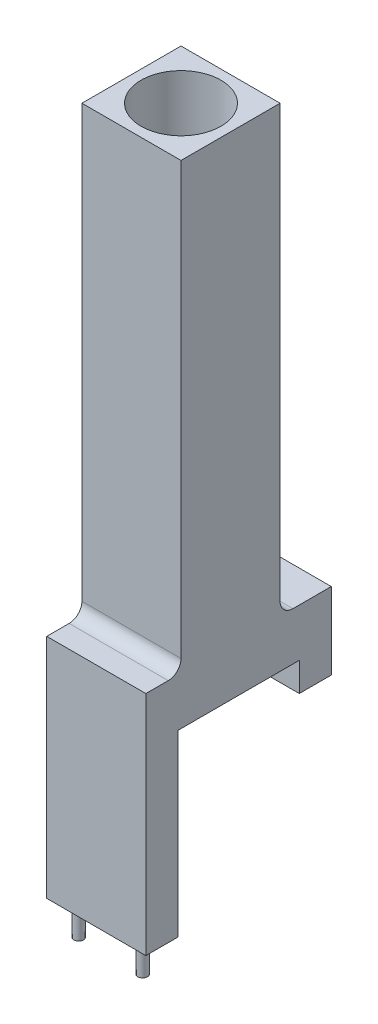
ISO-10303-21;
HEADER;
FILE_DESCRIPTION(('STEP AP214'),'2;1');
FILE_NAME('part.step','',(''),(''),'','','');
FILE_SCHEMA(('AUTOMOTIVE_DESIGN { 1 0 10303 214 1 1 1 1 }'));
ENDSEC;
DATA;
#1=APPLICATION_CONTEXT('core data for automotive mechanical design processes');
#2=APPLICATION_PROTOCOL_DEFINITION('international standard','automotive_design',2000,#1);
#3=PRODUCT_CONTEXT('',#1,'mechanical');
#4=PRODUCT('Part','Part','',(#3));
#5=PRODUCT_RELATED_PRODUCT_CATEGORY('part','',(#4));
#6=PRODUCT_DEFINITION_FORMATION('','',#4);
#7=PRODUCT_DEFINITION_CONTEXT('part definition',#1,'design');
#8=PRODUCT_DEFINITION('design','',#6,#7);
#9=PRODUCT_DEFINITION_SHAPE('','',#8);
#10=(LENGTH_UNIT() NAMED_UNIT(*) SI_UNIT(.MILLI.,.METRE.));
#11=(NAMED_UNIT(*) PLANE_ANGLE_UNIT() SI_UNIT($,.RADIAN.));
#12=(NAMED_UNIT(*) SI_UNIT($,.STERADIAN.) SOLID_ANGLE_UNIT());
#13=UNCERTAINTY_MEASURE_WITH_UNIT(LENGTH_MEASURE(1.E-05),#10,'distance_accuracy_value','');
#14=(GEOMETRIC_REPRESENTATION_CONTEXT(3) GLOBAL_UNCERTAINTY_ASSIGNED_CONTEXT((#13)) GLOBAL_UNIT_ASSIGNED_CONTEXT((#10,
#11,#12)) REPRESENTATION_CONTEXT('',''));
#15=CARTESIAN_POINT('',(0.,0.,0.));
#16=DIRECTION('',(0.,0.,1.));
#17=DIRECTION('',(1.,0.,0.));
#18=AXIS2_PLACEMENT_3D('',#15,#16,#17);
#19=CARTESIAN_POINT('',(15.5,28.5657137141714,-16.));
#20=DIRECTION('',(0.,1.,0.));
#21=DIRECTION('',(0.,0.,1.));
#22=AXIS2_PLACEMENT_3D('',#19,#20,#21);
#23=PLANE('',#22);
#24=DIRECTION('',(-1.,0.,0.));
#25=VECTOR('',#24,1.);
#26=CARTESIAN_POINT('',(-15.5,28.5657137141714,-6.));
#27=LINE('',#26,#25);
#28=CARTESIAN_POINT('',(15.5,28.5657137141714,-6.));
#29=VERTEX_POINT('',#28);
#30=CARTESIAN_POINT('',(-15.5,28.5657137141714,-6.));
#31=VERTEX_POINT('',#30);
#32=EDGE_CURVE('E173',#29,#31,#27,.T.);
#33=ORIENTED_EDGE('',*,*,#32,.F.);
#34=DIRECTION('',(0.,0.,1.));
#35=VECTOR('',#34,1.);
#36=CARTESIAN_POINT('',(15.5,28.5657137141714,-16.));
#37=LINE('',#36,#35);
#38=CARTESIAN_POINT('',(15.5,28.5657137141714,0.));
#39=VERTEX_POINT('',#38);
#40=EDGE_CURVE('E193',#29,#39,#37,.T.);
#41=ORIENTED_EDGE('',*,*,#40,.T.);
#42=DIRECTION('',(-1.,0.,0.));
#43=VECTOR('',#42,1.);
#44=CARTESIAN_POINT('',(15.5,28.5657137141714,0.));
#45=LINE('',#44,#43);
#46=CARTESIAN_POINT('',(-15.5,28.5657137141714,0.));
#47=VERTEX_POINT('',#46);
#48=EDGE_CURVE('E183',#39,#47,#45,.T.);
#49=ORIENTED_EDGE('',*,*,#48,.T.);
#50=DIRECTION('',(0.,0.,1.));
#51=VECTOR('',#50,1.);
#52=CARTESIAN_POINT('',(-15.5,28.5657137141714,-16.));
#53=LINE('',#52,#51);
#54=EDGE_CURVE('E191',#31,#47,#53,.T.);
#55=ORIENTED_EDGE('',*,*,#54,.F.);
#56=EDGE_LOOP('',(#33,#41,#49,#55));
#57=FACE_BOUND('',#56,.T.);
#58=ADVANCED_FACE('F37',(#57),#23,.F.);
#59=CARTESIAN_POINT('',(0.,0.,0.));
#60=DIRECTION('',(0.,0.,1.));
#61=DIRECTION('',(1.,0.,0.));
#62=AXIS2_PLACEMENT_3D('',#59,#60,#61);
#63=PLANE('',#62);
#64=DIRECTION('',(0.,1.,0.));
#65=VECTOR('',#64,1.);
#66=CARTESIAN_POINT('',(15.5,28.5657137141714,0.));
#67=LINE('',#66,#65);
#68=CARTESIAN_POINT('',(15.5,47.5657137141714,0.));
#69=VERTEX_POINT('',#68);
#70=CARTESIAN_POINT('',(15.5,182.5,0.));
#71=VERTEX_POINT('',#70);
#72=EDGE_CURVE('E252',#69,#71,#67,.T.);
#73=ORIENTED_EDGE('',*,*,#72,.F.);
#74=DIRECTION('',(1.,0.,0.));
#75=VECTOR('',#74,1.);
#76=CARTESIAN_POINT('',(-15.5,47.5657137141714,0.));
#77=LINE('',#76,#75);
#78=CARTESIAN_POINT('',(-15.5,47.5657137141714,0.));
#79=VERTEX_POINT('',#78);
#80=EDGE_CURVE('E58',#69,#79,#77,.F.);
#81=ORIENTED_EDGE('',*,*,#80,.T.);
#82=DIRECTION('',(0.,-1.,0.));
#83=VECTOR('',#82,1.);
#84=CARTESIAN_POINT('',(-15.5,182.5,0.));
#85=LINE('',#84,#83);
#86=CARTESIAN_POINT('',(-15.5,182.5,0.));
#87=VERTEX_POINT('',#86);
#88=EDGE_CURVE('E264',#87,#79,#85,.T.);
#89=ORIENTED_EDGE('',*,*,#88,.F.);
#90=DIRECTION('',(-1.,0.,0.));
#91=VECTOR('',#90,1.);
#92=CARTESIAN_POINT('',(15.5,182.5,0.));
#93=LINE('',#92,#91);
#94=EDGE_CURVE('E261',#71,#87,#93,.T.);
#95=ORIENTED_EDGE('',*,*,#94,.F.);
#96=EDGE_LOOP('',(#73,#81,#89,#95));
#97=FACE_BOUND('',#96,.T.);
#98=ADVANCED_FACE('F308',(#97),#63,.F.);
#99=CARTESIAN_POINT('',(-15.5,28.5657137141714,42.));
#100=DIRECTION('',(0.,1.,0.));
#101=DIRECTION('',(0.,0.,1.));
#102=AXIS2_PLACEMENT_3D('',#99,#100,#101);
#103=PLANE('',#102);
#104=DIRECTION('',(1.,0.,0.));
#105=VECTOR('',#104,1.);
#106=CARTESIAN_POINT('',(-15.5,28.5657137141714,32.));
#107=LINE('',#106,#105);
#108=CARTESIAN_POINT('',(-15.5,28.5657137141714,32.));
#109=VERTEX_POINT('',#108);
#110=CARTESIAN_POINT('',(15.5,28.5657137141714,32.));
#111=VERTEX_POINT('',#110);
#112=EDGE_CURVE('E205',#109,#111,#107,.T.);
#113=ORIENTED_EDGE('',*,*,#112,.F.);
#114=DIRECTION('',(0.,0.,-1.));
#115=VECTOR('',#114,1.);
#116=CARTESIAN_POINT('',(-15.5,28.5657137141714,42.));
#117=LINE('',#116,#115);
#118=CARTESIAN_POINT('',(-15.5,28.5657137141714,31.));
#119=VERTEX_POINT('',#118);
#120=EDGE_CURVE('E242',#109,#119,#117,.T.);
#121=ORIENTED_EDGE('',*,*,#120,.T.);
#122=DIRECTION('',(1.,0.,0.));
#123=VECTOR('',#122,1.);
#124=CARTESIAN_POINT('',(-15.5,28.5657137141714,31.));
#125=LINE('',#124,#123);
#126=CARTESIAN_POINT('',(15.5,28.5657137141714,31.));
#127=VERTEX_POINT('',#126);
#128=EDGE_CURVE('E225',#119,#127,#125,.T.);
#129=ORIENTED_EDGE('',*,*,#128,.T.);
#130=DIRECTION('',(0.,0.,-1.));
#131=VECTOR('',#130,1.);
#132=CARTESIAN_POINT('',(15.5,28.5657137141714,42.));
#133=LINE('',#132,#131);
#134=EDGE_CURVE('E240',#111,#127,#133,.T.);
#135=ORIENTED_EDGE('',*,*,#134,.F.);
#136=EDGE_LOOP('',(#113,#121,#129,#135));
#137=FACE_BOUND('',#136,.T.);
#138=ADVANCED_FACE('F302',(#137),#103,.F.);
#139=CARTESIAN_POINT('',(15.5,182.5,31.));
#140=DIRECTION('',(0.,-1.,0.));
#141=DIRECTION('',(0.,0.,-1.));
#142=AXIS2_PLACEMENT_3D('',#139,#140,#141);
#143=PLANE('',#142);
#144=CARTESIAN_POINT('',(0.,182.5,15.5));
#145=DIRECTION('',(0.,1.,0.));
#146=DIRECTION('',(0.,0.,1.));
#147=AXIS2_PLACEMENT_3D('',#144,#145,#146);
#148=CIRCLE('',#147,12.5);
#149=CARTESIAN_POINT('',(0.,182.5,28.));
#150=VERTEX_POINT('',#149);
#151=EDGE_CURVE('E244',#150,#150,#148,.T.);
#152=ORIENTED_EDGE('',*,*,#151,.F.);
#153=EDGE_LOOP('',(#152));
#154=FACE_BOUND('',#153,.T.);
#155=ORIENTED_EDGE('',*,*,#94,.T.);
#156=DIRECTION('',(0.,0.,-1.));
#157=VECTOR('',#156,1.);
#158=CARTESIAN_POINT('',(-15.5,182.5,31.));
#159=LINE('',#158,#157);
#160=CARTESIAN_POINT('',(-15.5,182.5,31.));
#161=VERTEX_POINT('',#160);
#162=EDGE_CURVE('E278',#161,#87,#159,.T.);
#163=ORIENTED_EDGE('',*,*,#162,.F.);
#164=DIRECTION('',(-1.,0.,0.));
#165=VECTOR('',#164,1.);
#166=CARTESIAN_POINT('',(15.5,182.5,31.));
#167=LINE('',#166,#165);
#168=CARTESIAN_POINT('',(15.5,182.5,31.));
#169=VERTEX_POINT('',#168);
#170=EDGE_CURVE('E248',#169,#161,#167,.T.);
#171=ORIENTED_EDGE('',*,*,#170,.F.);
#172=DIRECTION('',(0.,0.,-1.));
#173=VECTOR('',#172,1.);
#174=CARTESIAN_POINT('',(15.5,182.5,31.));
#175=LINE('',#174,#173);
#176=EDGE_CURVE('E260',#169,#71,#175,.T.);
#177=ORIENTED_EDGE('',*,*,#176,.T.);
#178=EDGE_LOOP('',(#155,#163,#171,#177));
#179=FACE_BOUND('',#178,.T.);
#180=ADVANCED_FACE('F387',(#154,#179),#143,.F.);
#181=CARTESIAN_POINT('',(-15.5,182.5,31.));
#182=DIRECTION('',(1.,0.,0.));
#183=DIRECTION('',(0.,1.,0.));
#184=AXIS2_PLACEMENT_3D('',#181,#182,#183);
#185=PLANE('',#184);
#186=ORIENTED_EDGE('',*,*,#88,.T.);
#187=CARTESIAN_POINT('',(-15.5,47.5657137141714,-4.));
#188=DIRECTION('',(1.,0.,0.));
#189=DIRECTION('',(0.,1.,0.));
#190=AXIS2_PLACEMENT_3D('',#187,#188,#189);
#191=CIRCLE('',#190,4.);
#192=CARTESIAN_POINT('',(-15.5,43.5657137141714,-4.));
#193=VERTEX_POINT('',#192);
#194=EDGE_CURVE('E11',#79,#193,#191,.T.);
#195=ORIENTED_EDGE('',*,*,#194,.T.);
#196=DIRECTION('',(0.,0.,1.));
#197=VECTOR('',#196,1.);
#198=CARTESIAN_POINT('',(-15.5,43.5657137141714,-16.));
#199=LINE('',#198,#197);
#200=CARTESIAN_POINT('',(-15.5,43.5657137141714,-16.));
#201=VERTEX_POINT('',#200);
#202=EDGE_CURVE('E155',#201,#193,#199,.T.);
#203=ORIENTED_EDGE('',*,*,#202,.F.);
#204=DIRECTION('',(0.,1.,0.));
#205=VECTOR('',#204,1.);
#206=CARTESIAN_POINT('',(-15.5,28.5657137141714,-16.));
#207=LINE('',#206,#205);
#208=CARTESIAN_POINT('',(-15.5,19.5657137141714,-16.));
#209=VERTEX_POINT('',#208);
#210=EDGE_CURVE('E148',#209,#201,#207,.T.);
#211=ORIENTED_EDGE('',*,*,#210,.F.);
#212=DIRECTION('',(0.,0.,-1.));
#213=VECTOR('',#212,1.);
#214=CARTESIAN_POINT('',(-15.5,19.5657137141714,-16.));
#215=LINE('',#214,#213);
#216=CARTESIAN_POINT('',(-15.5,19.5657137141714,-6.));
#217=VERTEX_POINT('',#216);
#218=EDGE_CURVE('E153',#217,#209,#215,.T.);
#219=ORIENTED_EDGE('',*,*,#218,.F.);
#220=DIRECTION('',(0.,1.,0.));
#221=VECTOR('',#220,1.);
#222=CARTESIAN_POINT('',(-15.5,19.5657137141714,-6.));
#223=LINE('',#222,#221);
#224=EDGE_CURVE('E178',#217,#31,#223,.T.);
#225=ORIENTED_EDGE('',*,*,#224,.T.);
#226=ORIENTED_EDGE('',*,*,#54,.T.);
#227=DIRECTION('',(0.,0.,-1.));
#228=VECTOR('',#227,1.);
#229=CARTESIAN_POINT('',(-15.5,28.5657137141714,31.));
#230=LINE('',#229,#228);
#231=EDGE_CURVE('E275',#119,#47,#230,.T.);
#232=ORIENTED_EDGE('',*,*,#231,.F.);
#233=ORIENTED_EDGE('',*,*,#120,.F.);
#234=DIRECTION('',(0.,1.,0.));
#235=VECTOR('',#234,1.);
#236=CARTESIAN_POINT('',(-15.5,-27.4342862858286,32.));
#237=LINE('',#236,#235);
#238=CARTESIAN_POINT('',(-15.5,-27.4342862858286,32.));
#239=VERTEX_POINT('',#238);
#240=EDGE_CURVE('E223',#239,#109,#237,.T.);
#241=ORIENTED_EDGE('',*,*,#240,.F.);
#242=DIRECTION('',(0.,0.,-1.));
#243=VECTOR('',#242,1.);
#244=CARTESIAN_POINT('',(-15.5,-27.4342862858286,42.));
#245=LINE('',#244,#243);
#246=CARTESIAN_POINT('',(-15.5,-27.4342862858286,42.));
#247=VERTEX_POINT('',#246);
#248=EDGE_CURVE('E208',#247,#239,#245,.T.);
#249=ORIENTED_EDGE('',*,*,#248,.F.);
#250=DIRECTION('',(0.,-1.,0.));
#251=VECTOR('',#250,1.);
#252=CARTESIAN_POINT('',(-15.5,43.5657137141714,42.));
#253=LINE('',#252,#251);
#254=CARTESIAN_POINT('',(-15.5,43.5657137141714,42.));
#255=VERTEX_POINT('',#254);
#256=EDGE_CURVE('E226',#255,#247,#253,.T.);
#257=ORIENTED_EDGE('',*,*,#256,.F.);
#258=DIRECTION('',(0.,0.,-1.));
#259=VECTOR('',#258,1.);
#260=CARTESIAN_POINT('',(-15.5,43.5657137141714,42.));
#261=LINE('',#260,#259);
#262=CARTESIAN_POINT('',(-15.5,43.5657137141714,35.));
#263=VERTEX_POINT('',#262);
#264=EDGE_CURVE('E232',#255,#263,#261,.T.);
#265=ORIENTED_EDGE('',*,*,#264,.T.);
#266=CARTESIAN_POINT('',(-15.5,47.5657137141714,35.));
#267=DIRECTION('',(1.,0.,0.));
#268=DIRECTION('',(0.,1.,0.));
#269=AXIS2_PLACEMENT_3D('',#266,#267,#268);
#270=CIRCLE('',#269,4.);
#271=CARTESIAN_POINT('',(-15.5,47.5657137141714,31.));
#272=VERTEX_POINT('',#271);
#273=EDGE_CURVE('E374',#263,#272,#270,.T.);
#274=ORIENTED_EDGE('',*,*,#273,.T.);
#275=DIRECTION('',(0.,-1.,0.));
#276=VECTOR('',#275,1.);
#277=CARTESIAN_POINT('',(-15.5,182.5,31.));
#278=LINE('',#277,#276);
#279=EDGE_CURVE('E251',#161,#272,#278,.T.);
#280=ORIENTED_EDGE('',*,*,#279,.F.);
#281=ORIENTED_EDGE('',*,*,#162,.T.);
#282=EDGE_LOOP('',(#186,#195,#203,#211,#219,#225,#226,#232,#233,#241,#249,#257,#265,#274,#280,#281));
#283=FACE_BOUND('',#282,.T.);
#284=ADVANCED_FACE('F150',(#283),#185,.F.);
#285=CARTESIAN_POINT('',(0.,0.,31.));
#286=DIRECTION('',(0.,0.,-1.));
#287=DIRECTION('',(-1.,0.,0.));
#288=AXIS2_PLACEMENT_3D('',#285,#286,#287);
#289=CYLINDRICAL_SURFACE('',#288,32.5);
#290=CARTESIAN_POINT('',(0.,32.5,28.));
#291=CARTESIAN_POINT('',(0.337836576797096,32.5000014858481,28.000001993995));
#292=CARTESIAN_POINT('',(0.675646419073798,32.4947211701503,27.9862937420786));
#293=CARTESIAN_POINT('',(1.34870111968519,32.4737482365528,27.9316118089023));
#294=CARTESIAN_POINT('',(1.68394624124221,32.4580567020813,27.8906409646826));
#295=CARTESIAN_POINT('',(2.34934871452611,32.4166882439333,27.7818646195122));
#296=CARTESIAN_POINT('',(2.67950706401439,32.3910133050893,27.7140644525374));
#297=CARTESIAN_POINT('',(3.33247627680054,32.3303591796677,27.5522920170705));
#298=CARTESIAN_POINT('',(3.655286909019,32.2953797009079,27.458318926689));
#299=CARTESIAN_POINT('',(4.29072361432594,32.2171068201874,27.2452866472738));
#300=CARTESIAN_POINT('',(4.60336922914889,32.1738306278612,27.1262793371601));
#301=CARTESIAN_POINT('',(5.21720005388813,32.0800129844634,26.8640755743457));
#302=CARTESIAN_POINT('',(5.51838536540989,32.029471597823,26.7208793361621));
#303=CARTESIAN_POINT('',(6.10753812636798,31.9223688998614,26.4114025835071));
#304=CARTESIAN_POINT('',(6.39550504684375,31.865807347931,26.2451211463047));
#305=CARTESIAN_POINT('',(6.95671971310771,31.7480126441507,25.8905854655627));
#306=CARTESIAN_POINT('',(7.22996167002814,31.6867776775584,25.7023226712112));
#307=CARTESIAN_POINT('',(7.7706537047966,31.5586304930565,25.2972200692385));
#308=CARTESIAN_POINT('',(8.03744733335522,31.4915895245141,25.0795445345004));
#309=CARTESIAN_POINT('',(8.55205593114125,31.3557523561662,24.6230858010536));
#310=CARTESIAN_POINT('',(8.79986216610441,31.2869553677547,24.3842929958416));
#311=CARTESIAN_POINT('',(9.27504004475683,31.1493955036273,23.8870100841506));
#312=CARTESIAN_POINT('',(9.50240511349479,31.0806326459122,23.628513689016));
#313=CARTESIAN_POINT('',(9.93516777355413,30.9450133423428,23.0934696553564));
#314=CARTESIAN_POINT('',(10.140574929647,30.8781560758053,22.8169299616453));
#315=CARTESIAN_POINT('',(10.5361926192171,30.7454705238633,22.2355247309291));
#316=CARTESIAN_POINT('',(10.7254328950547,30.6797972013217,21.929962362477));
#317=CARTESIAN_POINT('',(11.0772837609268,30.5545195371022,21.3028437932912));
#318=CARTESIAN_POINT('',(11.2399052407247,30.4949127174085,20.9812942034822));
#319=CARTESIAN_POINT('',(11.537197149669,30.3836845618775,20.3242192093027));
#320=CARTESIAN_POINT('',(11.6718706236739,30.3320623562946,19.9886953321798));
#321=CARTESIAN_POINT('',(11.9119727513701,30.2385768319002,19.3060217615066));
#322=CARTESIAN_POINT('',(12.0174032216406,30.1967129069289,18.9588727916107));
#323=CARTESIAN_POINT('',(12.1940327024765,30.125806828917,18.2706223819346));
#324=CARTESIAN_POINT('',(12.2665005265636,30.0962937506804,17.9298950679498));
#325=CARTESIAN_POINT('',(12.3828123832685,30.0486260105227,17.242798675196));
#326=CARTESIAN_POINT('',(12.4266571846729,30.0304710435341,16.8964297482112));
#327=CARTESIAN_POINT('',(12.4852075673048,30.0061760528473,16.2009482804609));
#328=CARTESIAN_POINT('',(12.4999242032444,30.0000314709825,15.851836831059));
#329=CARTESIAN_POINT('',(12.5000752025603,29.9999687768108,15.1536139337828));
#330=CARTESIAN_POINT('',(12.4855107857316,30.0060501551928,14.8045024865141));
#331=CARTESIAN_POINT('',(12.429132566831,30.0294439685778,14.1312699315952));
#332=CARTESIAN_POINT('',(12.3891100686744,30.0460177856045,13.8069711336992));
#333=CARTESIAN_POINT('',(12.2839560314935,30.0891616788465,13.1631642014051));
#334=CARTESIAN_POINT('',(12.2188257177663,30.1157312672523,12.8436558340177));
#335=CARTESIAN_POINT('',(12.064070266564,30.1780574892286,12.2115176237259));
#336=CARTESIAN_POINT('',(11.9744423853936,30.2138151518245,11.8988885555344));
#337=CARTESIAN_POINT('',(11.7714864797709,30.293464264234,11.2824886545358));
#338=CARTESIAN_POINT('',(11.6581576468484,30.3373559915053,10.9787181243079));
#339=CARTESIAN_POINT('',(11.4063068130956,30.4329532504431,10.3760489499068));
#340=CARTESIAN_POINT('',(11.2673412010473,30.4847931208213,10.077357163428));
#341=CARTESIAN_POINT('',(10.966727823749,30.5942227078782,9.49258707899246));
#342=CARTESIAN_POINT('',(10.8050717568344,30.6518145267645,9.20651344816111));
#343=CARTESIAN_POINT('',(10.4601861792418,30.7712170242723,8.6485709981369));
#344=CARTESIAN_POINT('',(10.2769543429051,30.8330281573926,8.37670371481884));
#345=CARTESIAN_POINT('',(9.89004205510004,30.9593035374755,7.84857949317793));
#346=CARTESIAN_POINT('',(9.68636062950952,31.0237679107395,7.59232329942892));
#347=CARTESIAN_POINT('',(9.24446718324196,31.1584161029858,7.07904233153633));
#348=CARTESIAN_POINT('',(9.00482867272834,31.2286800574564,6.8232649088032));
#349=CARTESIAN_POINT('',(8.50493372666239,31.3685101409535,6.33273832107719));
#350=CARTESIAN_POINT('',(8.24468559639744,31.4380765384775,6.09798076591755));
#351=CARTESIAN_POINT('',(7.70483283836485,31.5747226511574,5.65071118147546));
#352=CARTESIAN_POINT('',(7.42521665158465,31.6418008440226,5.43821262992373));
#353=CARTESIAN_POINT('',(6.84852311496038,31.771607462917,5.03715940513001));
#354=CARTESIAN_POINT('',(6.55145291574591,31.8343376476115,4.84859502513062));
#355=CARTESIAN_POINT('',(5.93625996496472,31.9548233059178,4.4936797074902));
#356=CARTESIAN_POINT('',(5.61786180256933,32.0124738683296,4.32776979618448));
#357=CARTESIAN_POINT('',(4.96685522977237,32.1199186127321,4.02352681167766));
#358=CARTESIAN_POINT('',(4.63424653718921,32.1697126386216,3.88519428639604));
#359=CARTESIAN_POINT('',(3.95732331030257,32.2599771617885,3.63747776509059));
#360=CARTESIAN_POINT('',(3.61301326443366,32.300451188749,3.52808280744804));
#361=CARTESIAN_POINT('',(2.91521092744542,32.370889364124,3.33931913715329));
#362=CARTESIAN_POINT('',(2.56171921966379,32.4008541784737,3.25994852192951));
#363=CARTESIAN_POINT('',(1.86822654149732,32.4480160606902,3.13566196416776));
#364=CARTESIAN_POINT('',(1.52856560402226,32.4658294122302,3.08907834234039));
#365=CARTESIAN_POINT('',(0.846177822415279,32.4907760537283,3.02396536204923));
#366=CARTESIAN_POINT('',(0.503451092196715,32.4979097388581,3.00543496555238));
#367=CARTESIAN_POINT('',(-0.18234638558213,32.5012971160742,2.99662728409562));
#368=CARTESIAN_POINT('',(-0.525417047665262,32.4975530506074,3.00634417596132));
#369=CARTESIAN_POINT('',(-1.20930851007697,32.4792945740625,3.05391389996297));
#370=CARTESIAN_POINT('',(-1.55012934778272,32.4647803423699,3.09176626348092));
#371=CARTESIAN_POINT('',(-2.21305573781644,32.4261945922102,3.19308386801296));
#372=CARTESIAN_POINT('',(-2.53535633529605,32.4025385760353,3.2554373415451));
#373=CARTESIAN_POINT('',(-3.17330734732858,32.3462927567292,3.40506473925271));
#374=CARTESIAN_POINT('',(-3.48895798981923,32.3137032603453,3.49233780777246));
#375=CARTESIAN_POINT('',(-4.11160846214195,32.2403933537209,3.69104216297893));
#376=CARTESIAN_POINT('',(-4.41860758802012,32.1996722840003,3.80247540914692));
#377=CARTESIAN_POINT('',(-5.0220758323634,32.1110849542513,4.04858300475126));
#378=CARTESIAN_POINT('',(-5.31854459692326,32.0632184543593,4.18325813441326));
#379=CARTESIAN_POINT('',(-5.90788780672696,31.9599593197607,4.4791657077339));
#380=CARTESIAN_POINT('',(-6.20039403196736,31.9043853909989,4.64106807003787));
#381=CARTESIAN_POINT('',(-6.77089024325919,31.7882027513973,4.98732028569481));
#382=CARTESIAN_POINT('',(-7.04887479299824,31.7275921767349,5.17167846073493));
#383=CARTESIAN_POINT('',(-7.5887545349965,31.6028097457927,5.56160479328448));
#384=CARTESIAN_POINT('',(-7.85064743289137,31.5386373841408,5.76717596422032));
#385=CARTESIAN_POINT('',(-8.35693289915545,31.4082794568399,6.19826757178262));
#386=CARTESIAN_POINT('',(-8.60132478091287,31.3420938123494,6.42378879032791));
#387=CARTESIAN_POINT('',(-9.0857504740377,31.2052290218407,6.90794067673282));
#388=CARTESIAN_POINT('',(-9.3245965278678,31.1345233678042,7.16775387326328));
#389=CARTESIAN_POINT('',(-9.77955606416925,30.9946272278478,7.70675842068411));
#390=CARTESIAN_POINT('',(-9.99567902379111,30.9254361198645,7.98594161161521));
#391=CARTESIAN_POINT('',(-10.4040109365392,30.7904666087189,8.5623232137296));
#392=CARTESIAN_POINT('',(-10.5962059566684,30.7246902067803,8.85953197262626));
#393=CARTESIAN_POINT('',(-10.9550625967691,30.598574740042,9.46991856158089));
#394=CARTESIAN_POINT('',(-11.1217351197363,30.5382333580096,9.78308949609661));
#395=CARTESIAN_POINT('',(-11.4292730930952,30.4244768010409,10.4256161603052));
#396=CARTESIAN_POINT('',(-11.5699665785565,30.3711084179073,10.7550626333341));
#397=CARTESIAN_POINT('',(-11.8229161820429,30.2735371507908,11.4260351589831));
#398=CARTESIAN_POINT('',(-11.9351719982129,30.2293343640982,11.7675613397809));
#399=CARTESIAN_POINT('',(-12.1300251663235,30.1516749468945,12.4599734163671));
#400=CARTESIAN_POINT('',(-12.2126389587628,30.1182123605837,12.8108540074911));
#401=CARTESIAN_POINT('',(-12.347347462325,30.0632388267647,13.5193422493093));
#402=CARTESIAN_POINT('',(-12.3994444593826,30.0417269840631,13.876949394063));
#403=CARTESIAN_POINT('',(-12.4700355860757,30.0124899541665,14.5716686201911));
#404=CARTESIAN_POINT('',(-12.4905540874282,30.0039348248892,14.9085414958595));
#405=CARTESIAN_POINT('',(-12.5042733999444,29.9982201271177,15.5829323221159));
#406=CARTESIAN_POINT('',(-12.4974754902856,30.0010600250152,15.9204502417579));
#407=CARTESIAN_POINT('',(-12.4566410320723,30.0180375072707,16.5935076797743));
#408=CARTESIAN_POINT('',(-12.4226072060802,30.0321739623997,16.9290473925175));
#409=CARTESIAN_POINT('',(-12.3276744203618,30.0712665333475,17.5956596040771));
#410=CARTESIAN_POINT('',(-12.2667755151395,30.0962226272155,17.9267321119551));
#411=CARTESIAN_POINT('',(-12.1212692462898,30.1551116456071,18.5708494113773));
#412=CARTESIAN_POINT('',(-12.0375402984542,30.1887097692855,18.8841241132371));
#413=CARTESIAN_POINT('',(-11.8463246437013,30.2642553807919,19.5024173941431));
#414=CARTESIAN_POINT('',(-11.7388294874756,30.3062058374936,19.8074329935344));
#415=CARTESIAN_POINT('',(-11.501003763072,30.3972549424326,20.4072374016636));
#416=CARTESIAN_POINT('',(-11.3706779063604,30.4463521154822,20.7020283054172));
#417=CARTESIAN_POINT('',(-11.0880766958676,30.5504046976091,21.2799725025733));
#418=CARTESIAN_POINT('',(-10.9357913603118,30.6053627678072,21.5631204279804));
#419=CARTESIAN_POINT('',(-10.6014757544643,30.7228217147294,22.1312259001551));
#420=CARTESIAN_POINT('',(-10.4182790286402,30.7855701603389,22.4154461547296));
#421=CARTESIAN_POINT('',(-10.0299458981895,30.9142685538483,22.9675332775858));
#422=CARTESIAN_POINT('',(-9.82481763482346,30.9802173088228,23.2354061566135));
#423=CARTESIAN_POINT('',(-9.39365602037941,31.113665404182,23.7536610585337));
#424=CARTESIAN_POINT('',(-9.16760890820722,31.1811657429909,24.0040313748607));
#425=CARTESIAN_POINT('',(-8.696082385407,31.3159424571287,24.4856379580709));
#426=CARTESIAN_POINT('',(-8.45060949727746,31.3832188997944,24.7168805944731));
#427=CARTESIAN_POINT('',(-7.92660987150273,31.5197772050651,25.1719275168523));
#428=CARTESIAN_POINT('',(-7.64699001785467,31.5889467722863,25.3945089625188));
#429=CARTESIAN_POINT('',(-7.0690734930213,31.7232753869772,25.8153271264768));
#430=CARTESIAN_POINT('',(-6.77077634855599,31.7884343327354,26.0135632274834));
#431=CARTESIAN_POINT('',(-6.15729613308856,31.9129388230043,26.3842156738373));
#432=CARTESIAN_POINT('',(-5.84210974945129,31.9722832205527,26.556626928576));
#433=CARTESIAN_POINT('',(-5.19697196812804,32.0834633977846,26.8741259529693));
#434=CARTESIAN_POINT('',(-4.86702007342906,32.1352989244674,27.0192128020161));
#435=CARTESIAN_POINT('',(-4.17264073325585,32.2330552453392,27.2892638928707));
#436=CARTESIAN_POINT('',(-3.80737026888949,32.2783668866657,27.4122896453467));
#437=CARTESIAN_POINT('',(-3.06581046120039,32.3572222779021,27.624336296155));
#438=CARTESIAN_POINT('',(-2.68952032228379,32.3907651758565,27.7133547326927));
#439=CARTESIAN_POINT('',(-1.9295825115482,32.444903163824,27.8562176902785));
#440=CARTESIAN_POINT('',(-1.54593846561329,32.4655044737244,27.9100791087115));
#441=CARTESIAN_POINT('',(-0.774850858737181,32.4930510592465,27.9819665469636));
#442=CARTESIAN_POINT('',(-0.387407851512583,32.4999982961312,27.9999977134231));
#443=CARTESIAN_POINT('',(0.,32.5,28.));
#444=B_SPLINE_CURVE_WITH_KNOTS('',3,(#290,#291,#292,#293,#294,#295,#296,#297,#298,#299,#300,
#301,#302,#303,#304,#305,#306,#307,#308,#309,#310,#311,#312,#313,#314,#315,#316,#317,#318,#319,
#320,#321,#322,#323,#324,#325,#326,#327,#328,#329,#330,#331,#332,#333,#334,#335,#336,#337,#338,
#339,#340,#341,#342,#343,#344,#345,#346,#347,#348,#349,#350,#351,#352,#353,#354,#355,#356,#357,
#358,#359,#360,#361,#362,#363,#364,#365,#366,#367,#368,#369,#370,#371,#372,#373,#374,#375,#376,
#377,#378,#379,#380,#381,#382,#383,#384,#385,#386,#387,#388,#389,#390,#391,#392,#393,#394,#395,
#396,#397,#398,#399,#400,#401,#402,#403,#404,#405,#406,#407,#408,#409,#410,#411,#412,#413,#414,
#415,#416,#417,#418,#419,#420,#421,#422,#423,#424,#425,#426,#427,#428,#429,#430,#431,#432,#433,
#434,#435,#436,#437,#438,#439,#440,#441,#442,#443),.UNSPECIFIED.,.T.,.F.,(4,2,2,2,2,2,2,2,2,2,2,
2,2,2,2,2,2,2,2,2,2,2,2,2,2,2,2,2,2,2,2,2,2,2,2,2,2,2,2,2,2,2,2,2,2,2,2,2,2,2,2,2,2,2,2,2,2,2,2,
2,2,2,2,2,2,2,2,2,2,2,2,2,2,2,2,2,4),(0.,1.01314595975048,2.02618650449893,3.03902574631696,
4.05189679717286,5.06268917606959,6.07347259133179,7.08429641992878,8.09551478028225,
9.14672589398078,10.1984177008507,11.2504465856736,12.3020153277499,13.3967609426597,
14.4910575711259,15.5852349163197,16.6793442758452,17.726762896864,18.7741533840765,
19.82114628971,20.8680955804434,21.8484829808636,22.8288225430416,23.809271946983,
24.789754800777,25.7891419927472,26.7888957841688,27.7887574381648,28.7886667434743,
29.8598534845726,30.9306107330479,32.0020126176474,33.0729785859505,34.1624833832819,
35.2520098252111,36.3411229590213,37.4301670667424,38.4587723565712,39.4873395847373,
40.5156947889557,41.5440328655077,42.5302803600795,43.5164939942756,44.5027876440464,
45.4891144099522,46.5047330614098,47.5207292330266,48.5368699318705,49.5530504748226,
50.6315897362553,51.709677370463,52.7883898569161,53.8666402331481,54.9517903605402,
56.0369520059121,57.1215108490711,58.2059884403217,59.2175271330167,60.2290184577633,
61.2404086842304,62.2517968587977,63.2287277896937,64.2060065969525,65.1830839647583,
66.1606068755155,67.1912327772456,68.2214774174347,69.252404669877,70.2829872297012,
71.3737490421794,72.4645385056074,73.5555427039186,74.6465836535307,75.8090320001179,
76.9715644805817,78.1335378052259,79.2953442125035),.UNSPECIFIED.);
#445=CARTESIAN_POINT('',(0.,32.5,28.));
#446=VERTEX_POINT('',#445);
#447=EDGE_CURVE('E247',#446,#446,#444,.T.);
#448=ORIENTED_EDGE('',*,*,#447,.T.);
#449=EDGE_LOOP('',(#448));
#450=FACE_BOUND('',#449,.T.);
#451=CARTESIAN_POINT('',(0.,0.,0.));
#452=DIRECTION('',(0.,0.,-1.));
#453=DIRECTION('',(1.,0.,0.));
#454=AXIS2_PLACEMENT_3D('',#451,#452,#453);
#455=CIRCLE('',#454,32.5);
#456=EDGE_CURVE('E266',#47,#39,#455,.T.);
#457=ORIENTED_EDGE('',*,*,#456,.T.);
#458=DIRECTION('',(0.,0.,-1.));
#459=VECTOR('',#458,1.);
#460=CARTESIAN_POINT('',(15.5,28.5657137141714,31.));
#461=LINE('',#460,#459);
#462=EDGE_CURVE('E272',#127,#39,#461,.T.);
#463=ORIENTED_EDGE('',*,*,#462,.F.);
#464=CARTESIAN_POINT('',(0.,0.,31.));
#465=DIRECTION('',(0.,0.,-1.));
#466=DIRECTION('',(1.,0.,0.));
#467=AXIS2_PLACEMENT_3D('',#464,#465,#466);
#468=CIRCLE('',#467,32.5);
#469=EDGE_CURVE('E255',#119,#127,#468,.T.);
#470=ORIENTED_EDGE('',*,*,#469,.F.);
#471=ORIENTED_EDGE('',*,*,#231,.T.);
#472=EDGE_LOOP('',(#457,#463,#470,#471));
#473=FACE_BOUND('',#472,.T.);
#474=ADVANCED_FACE('F290',(#450,#473),#289,.F.);
#475=CARTESIAN_POINT('',(15.5,28.5657137141714,31.));
#476=DIRECTION('',(-1.,0.,0.));
#477=DIRECTION('',(0.,-1.,0.));
#478=AXIS2_PLACEMENT_3D('',#475,#476,#477);
#479=PLANE('',#478);
#480=ORIENTED_EDGE('',*,*,#462,.T.);
#481=ORIENTED_EDGE('',*,*,#40,.F.);
#482=DIRECTION('',(0.,1.,0.));
#483=VECTOR('',#482,1.);
#484=CARTESIAN_POINT('',(15.5,19.5657137141714,-6.));
#485=LINE('',#484,#483);
#486=CARTESIAN_POINT('',(15.5,19.5657137141714,-6.));
#487=VERTEX_POINT('',#486);
#488=EDGE_CURVE('E181',#487,#29,#485,.T.);
#489=ORIENTED_EDGE('',*,*,#488,.F.);
#490=DIRECTION('',(0.,0.,1.));
#491=VECTOR('',#490,1.);
#492=CARTESIAN_POINT('',(15.5,19.5657137141714,-16.));
#493=LINE('',#492,#491);
#494=CARTESIAN_POINT('',(15.5,19.5657137141714,-16.));
#495=VERTEX_POINT('',#494);
#496=EDGE_CURVE('E167',#495,#487,#493,.T.);
#497=ORIENTED_EDGE('',*,*,#496,.F.);
#498=DIRECTION('',(0.,-1.,0.));
#499=VECTOR('',#498,1.);
#500=CARTESIAN_POINT('',(15.5,28.5657137141714,-16.));
#501=LINE('',#500,#499);
#502=CARTESIAN_POINT('',(15.5,43.5657137141714,-16.));
#503=VERTEX_POINT('',#502);
#504=EDGE_CURVE('E159',#503,#495,#501,.T.);
#505=ORIENTED_EDGE('',*,*,#504,.F.);
#506=DIRECTION('',(0.,0.,1.));
#507=VECTOR('',#506,1.);
#508=CARTESIAN_POINT('',(15.5,43.5657137141714,-16.));
#509=LINE('',#508,#507);
#510=CARTESIAN_POINT('',(15.5,43.5657137141714,-4.));
#511=VERTEX_POINT('',#510);
#512=EDGE_CURVE('E186',#503,#511,#509,.T.);
#513=ORIENTED_EDGE('',*,*,#512,.T.);
#514=CARTESIAN_POINT('',(15.5,47.5657137141714,-4.));
#515=DIRECTION('',(-1.,0.,0.));
#516=DIRECTION('',(0.,-1.,0.));
#517=AXIS2_PLACEMENT_3D('',#514,#515,#516);
#518=CIRCLE('',#517,4.);
#519=EDGE_CURVE('E45',#511,#69,#518,.T.);
#520=ORIENTED_EDGE('',*,*,#519,.T.);
#521=ORIENTED_EDGE('',*,*,#72,.T.);
#522=ORIENTED_EDGE('',*,*,#176,.F.);
#523=DIRECTION('',(0.,1.,0.));
#524=VECTOR('',#523,1.);
#525=CARTESIAN_POINT('',(15.5,28.5657137141714,31.));
#526=LINE('',#525,#524);
#527=CARTESIAN_POINT('',(15.5,47.5657137141714,31.));
#528=VERTEX_POINT('',#527);
#529=EDGE_CURVE('E258',#528,#169,#526,.T.);
#530=ORIENTED_EDGE('',*,*,#529,.F.);
#531=CARTESIAN_POINT('',(15.5,47.5657137141714,35.));
#532=DIRECTION('',(-1.,0.,0.));
#533=DIRECTION('',(0.,-1.,0.));
#534=AXIS2_PLACEMENT_3D('',#531,#532,#533);
#535=CIRCLE('',#534,4.);
#536=CARTESIAN_POINT('',(15.5,43.5657137141714,35.));
#537=VERTEX_POINT('',#536);
#538=EDGE_CURVE('E373',#528,#537,#535,.T.);
#539=ORIENTED_EDGE('',*,*,#538,.T.);
#540=DIRECTION('',(0.,0.,-1.));
#541=VECTOR('',#540,1.);
#542=CARTESIAN_POINT('',(15.5,43.5657137141714,42.));
#543=LINE('',#542,#541);
#544=CARTESIAN_POINT('',(15.5,43.5657137141714,42.));
#545=VERTEX_POINT('',#544);
#546=EDGE_CURVE('E237',#545,#537,#543,.T.);
#547=ORIENTED_EDGE('',*,*,#546,.F.);
#548=DIRECTION('',(0.,1.,0.));
#549=VECTOR('',#548,1.);
#550=CARTESIAN_POINT('',(15.5,43.5657137141714,42.));
#551=LINE('',#550,#549);
#552=CARTESIAN_POINT('',(15.5,-27.4342862858286,42.));
#553=VERTEX_POINT('',#552);
#554=EDGE_CURVE('E228',#553,#545,#551,.T.);
#555=ORIENTED_EDGE('',*,*,#554,.F.);
#556=DIRECTION('',(0.,0.,1.));
#557=VECTOR('',#556,1.);
#558=CARTESIAN_POINT('',(15.5,-27.4342862858286,42.));
#559=LINE('',#558,#557);
#560=CARTESIAN_POINT('',(15.5,-27.4342862858286,32.));
#561=VERTEX_POINT('',#560);
#562=EDGE_CURVE('E213',#561,#553,#559,.T.);
#563=ORIENTED_EDGE('',*,*,#562,.F.);
#564=DIRECTION('',(0.,1.,0.));
#565=VECTOR('',#564,1.);
#566=CARTESIAN_POINT('',(15.5,-27.4342862858286,32.));
#567=LINE('',#566,#565);
#568=EDGE_CURVE('E219',#561,#111,#567,.T.);
#569=ORIENTED_EDGE('',*,*,#568,.T.);
#570=ORIENTED_EDGE('',*,*,#134,.T.);
#571=EDGE_LOOP('',(#480,#481,#489,#497,#505,#513,#520,#521,#522,#530,#539,#547,#555,#563,#569,#570));
#572=FACE_BOUND('',#571,.T.);
#573=ADVANCED_FACE('F306',(#572),#479,.F.);
#574=CARTESIAN_POINT('',(0.,0.,31.));
#575=DIRECTION('',(0.,0.,1.));
#576=DIRECTION('',(1.,0.,0.));
#577=AXIS2_PLACEMENT_3D('',#574,#575,#576);
#578=PLANE('',#577);
#579=ORIENTED_EDGE('',*,*,#279,.T.);
#580=DIRECTION('',(-1.,0.,0.));
#581=VECTOR('',#580,1.);
#582=CARTESIAN_POINT('',(0.,47.5657137141714,31.));
#583=LINE('',#582,#581);
#584=EDGE_CURVE('E375',#272,#528,#583,.F.);
#585=ORIENTED_EDGE('',*,*,#584,.T.);
#586=ORIENTED_EDGE('',*,*,#529,.T.);
#587=ORIENTED_EDGE('',*,*,#170,.T.);
#588=EDGE_LOOP('',(#579,#585,#586,#587));
#589=FACE_BOUND('',#588,.T.);
#590=ADVANCED_FACE('F300',(#589),#578,.T.);
#591=CARTESIAN_POINT('',(0.,28.5657137141714,15.5));
#592=DIRECTION('',(0.,1.,0.));
#593=DIRECTION('',(0.,0.,1.));
#594=AXIS2_PLACEMENT_3D('',#591,#592,#593);
#595=CYLINDRICAL_SURFACE('',#594,12.5);
#596=ORIENTED_EDGE('',*,*,#151,.T.);
#597=EDGE_LOOP('',(#596));
#598=FACE_BOUND('',#597,.T.);
#599=ORIENTED_EDGE('',*,*,#447,.F.);
#600=EDGE_LOOP('',(#599));
#601=FACE_BOUND('',#600,.T.);
#602=ADVANCED_FACE('F294',(#598,#601),#595,.F.);
#603=CARTESIAN_POINT('',(0.,0.,31.));
#604=DIRECTION('',(0.,0.,1.));
#605=DIRECTION('',(1.,0.,0.));
#606=AXIS2_PLACEMENT_3D('',#603,#604,#605);
#607=PLANE('',#606);
#608=ORIENTED_EDGE('',*,*,#128,.F.);
#609=ORIENTED_EDGE('',*,*,#469,.T.);
#610=EDGE_LOOP('',(#608,#609));
#611=FACE_BOUND('',#610,.T.);
#612=ADVANCED_FACE('F299',(#611),#607,.F.);
#613=CARTESIAN_POINT('',(-15.5,43.5657137141714,42.));
#614=DIRECTION('',(0.,-1.,0.));
#615=DIRECTION('',(0.,0.,-1.));
#616=AXIS2_PLACEMENT_3D('',#613,#614,#615);
#617=PLANE('',#616);
#618=ORIENTED_EDGE('',*,*,#546,.T.);
#619=DIRECTION('',(-1.,0.,0.));
#620=VECTOR('',#619,1.);
#621=CARTESIAN_POINT('',(-15.5,43.5657137141714,35.));
#622=LINE('',#621,#620);
#623=EDGE_CURVE('E281',#537,#263,#622,.T.);
#624=ORIENTED_EDGE('',*,*,#623,.T.);
#625=ORIENTED_EDGE('',*,*,#264,.F.);
#626=DIRECTION('',(-1.,0.,0.));
#627=VECTOR('',#626,1.);
#628=CARTESIAN_POINT('',(-15.5,43.5657137141714,42.));
#629=LINE('',#628,#627);
#630=EDGE_CURVE('E230',#545,#255,#629,.T.);
#631=ORIENTED_EDGE('',*,*,#630,.F.);
#632=EDGE_LOOP('',(#618,#624,#625,#631));
#633=FACE_BOUND('',#632,.T.);
#634=ADVANCED_FACE('F355',(#633),#617,.F.);
#635=CARTESIAN_POINT('',(0.,0.,42.));
#636=DIRECTION('',(0.,0.,1.));
#637=DIRECTION('',(1.,0.,0.));
#638=AXIS2_PLACEMENT_3D('',#635,#636,#637);
#639=PLANE('',#638);
#640=ORIENTED_EDGE('',*,*,#256,.T.);
#641=DIRECTION('',(-1.,0.,0.));
#642=VECTOR('',#641,1.);
#643=CARTESIAN_POINT('',(-15.5,-27.4342862858286,42.));
#644=LINE('',#643,#642);
#645=EDGE_CURVE('E216',#553,#247,#644,.T.);
#646=ORIENTED_EDGE('',*,*,#645,.F.);
#647=ORIENTED_EDGE('',*,*,#554,.T.);
#648=ORIENTED_EDGE('',*,*,#630,.T.);
#649=EDGE_LOOP('',(#640,#646,#647,#648));
#650=FACE_BOUND('',#649,.T.);
#651=ADVANCED_FACE('F351',(#650),#639,.T.);
#652=CARTESIAN_POINT('',(-15.5,-27.4342862858286,32.));
#653=DIRECTION('',(0.,0.,1.));
#654=DIRECTION('',(1.,0.,0.));
#655=AXIS2_PLACEMENT_3D('',#652,#653,#654);
#656=PLANE('',#655);
#657=ORIENTED_EDGE('',*,*,#112,.T.);
#658=ORIENTED_EDGE('',*,*,#568,.F.);
#659=DIRECTION('',(1.,0.,0.));
#660=VECTOR('',#659,1.);
#661=CARTESIAN_POINT('',(-15.5,-27.4342862858286,32.));
#662=LINE('',#661,#660);
#663=EDGE_CURVE('E211',#239,#561,#662,.T.);
#664=ORIENTED_EDGE('',*,*,#663,.F.);
#665=ORIENTED_EDGE('',*,*,#240,.T.);
#666=EDGE_LOOP('',(#657,#658,#664,#665));
#667=FACE_BOUND('',#666,.T.);
#668=ADVANCED_FACE('F347',(#667),#656,.F.);
#669=CARTESIAN_POINT('',(0.,-27.4342862858286,0.));
#670=DIRECTION('',(0.,-1.,0.));
#671=DIRECTION('',(0.,0.,-1.));
#672=AXIS2_PLACEMENT_3D('',#669,#670,#671);
#673=PLANE('',#672);
#674=CARTESIAN_POINT('',(10.,-27.4342862858286,37.5));
#675=DIRECTION('',(0.,-1.,0.));
#676=DIRECTION('',(0.,0.,-1.));
#677=AXIS2_PLACEMENT_3D('',#674,#675,#676);
#678=CIRCLE('',#677,1.5);
#679=CARTESIAN_POINT('',(10.,-27.4342862858286,36.));
#680=VERTEX_POINT('',#679);
#681=EDGE_CURVE('E196',#680,#680,#678,.T.);
#682=ORIENTED_EDGE('',*,*,#681,.F.);
#683=EDGE_LOOP('',(#682));
#684=FACE_BOUND('',#683,.T.);
#685=CARTESIAN_POINT('',(-10.,-27.4342862858286,37.5));
#686=DIRECTION('',(0.,-1.,0.));
#687=DIRECTION('',(0.,0.,-1.));
#688=AXIS2_PLACEMENT_3D('',#685,#686,#687);
#689=CIRCLE('',#688,1.5);
#690=CARTESIAN_POINT('',(-10.,-27.4342862858286,36.));
#691=VERTEX_POINT('',#690);
#692=EDGE_CURVE('E199',#691,#691,#689,.T.);
#693=ORIENTED_EDGE('',*,*,#692,.F.);
#694=EDGE_LOOP('',(#693));
#695=FACE_BOUND('',#694,.T.);
#696=ORIENTED_EDGE('',*,*,#248,.T.);
#697=ORIENTED_EDGE('',*,*,#663,.T.);
#698=ORIENTED_EDGE('',*,*,#562,.T.);
#699=ORIENTED_EDGE('',*,*,#645,.T.);
#700=EDGE_LOOP('',(#696,#697,#698,#699));
#701=FACE_BOUND('',#700,.T.);
#702=ADVANCED_FACE('F343',(#684,#695,#701),#673,.T.);
#703=CARTESIAN_POINT('',(-10.,-37.4342862858286,37.5));
#704=DIRECTION('',(0.,1.,0.));
#705=DIRECTION('',(0.,0.,1.));
#706=AXIS2_PLACEMENT_3D('',#703,#704,#705);
#707=CYLINDRICAL_SURFACE('',#706,1.5);
#708=CARTESIAN_POINT('',(-10.,-37.4342862858286,37.5));
#709=DIRECTION('',(0.,-1.,0.));
#710=DIRECTION('',(0.,0.,-1.));
#711=AXIS2_PLACEMENT_3D('',#708,#709,#710);
#712=CIRCLE('',#711,1.5);
#713=CARTESIAN_POINT('',(-10.,-37.4342862858286,36.));
#714=VERTEX_POINT('',#713);
#715=EDGE_CURVE('E202',#714,#714,#712,.T.);
#716=ORIENTED_EDGE('',*,*,#715,.F.);
#717=EDGE_LOOP('',(#716));
#718=FACE_BOUND('',#717,.T.);
#719=ORIENTED_EDGE('',*,*,#692,.T.);
#720=EDGE_LOOP('',(#719));
#721=FACE_BOUND('',#720,.T.);
#722=ADVANCED_FACE('F339',(#718,#721),#707,.T.);
#723=CARTESIAN_POINT('',(-10.,-37.4342862858286,37.5));
#724=DIRECTION('',(0.,-1.,0.));
#725=DIRECTION('',(0.,0.,-1.));
#726=AXIS2_PLACEMENT_3D('',#723,#724,#725);
#727=PLANE('',#726);
#728=ORIENTED_EDGE('',*,*,#715,.T.);
#729=EDGE_LOOP('',(#728));
#730=FACE_BOUND('',#729,.T.);
#731=ADVANCED_FACE('F331',(#730),#727,.T.);
#732=CARTESIAN_POINT('',(10.,-37.4342862858286,37.5));
#733=DIRECTION('',(0.,1.,0.));
#734=DIRECTION('',(0.,0.,1.));
#735=AXIS2_PLACEMENT_3D('',#732,#733,#734);
#736=CYLINDRICAL_SURFACE('',#735,1.5);
#737=CARTESIAN_POINT('',(10.,-37.4342862858286,37.5));
#738=DIRECTION('',(0.,-1.,0.));
#739=DIRECTION('',(0.,0.,-1.));
#740=AXIS2_PLACEMENT_3D('',#737,#738,#739);
#741=CIRCLE('',#740,1.5);
#742=CARTESIAN_POINT('',(10.,-37.4342862858286,36.));
#743=VERTEX_POINT('',#742);
#744=EDGE_CURVE('E195',#743,#743,#741,.T.);
#745=ORIENTED_EDGE('',*,*,#744,.F.);
#746=EDGE_LOOP('',(#745));
#747=FACE_BOUND('',#746,.T.);
#748=ORIENTED_EDGE('',*,*,#681,.T.);
#749=EDGE_LOOP('',(#748));
#750=FACE_BOUND('',#749,.T.);
#751=ADVANCED_FACE('F327',(#747,#750),#736,.T.);
#752=CARTESIAN_POINT('',(10.,-37.4342862858286,37.5));
#753=DIRECTION('',(0.,-1.,0.));
#754=DIRECTION('',(0.,0.,-1.));
#755=AXIS2_PLACEMENT_3D('',#752,#753,#754);
#756=PLANE('',#755);
#757=ORIENTED_EDGE('',*,*,#744,.T.);
#758=EDGE_LOOP('',(#757));
#759=FACE_BOUND('',#758,.T.);
#760=ADVANCED_FACE('F330',(#759),#756,.T.);
#761=CARTESIAN_POINT('',(0.,0.,0.));
#762=DIRECTION('',(0.,0.,1.));
#763=DIRECTION('',(1.,0.,0.));
#764=AXIS2_PLACEMENT_3D('',#761,#762,#763);
#765=PLANE('',#764);
#766=ORIENTED_EDGE('',*,*,#456,.F.);
#767=ORIENTED_EDGE('',*,*,#48,.F.);
#768=EDGE_LOOP('',(#766,#767));
#769=FACE_BOUND('',#768,.T.);
#770=ADVANCED_FACE('F335',(#769),#765,.T.);
#771=CARTESIAN_POINT('',(15.5,43.5657137141714,-16.));
#772=DIRECTION('',(0.,-1.,0.));
#773=DIRECTION('',(0.,0.,-1.));
#774=AXIS2_PLACEMENT_3D('',#771,#772,#773);
#775=PLANE('',#774);
#776=ORIENTED_EDGE('',*,*,#202,.T.);
#777=DIRECTION('',(1.,0.,0.));
#778=VECTOR('',#777,1.);
#779=CARTESIAN_POINT('',(15.5,43.5657137141714,-4.));
#780=LINE('',#779,#778);
#781=EDGE_CURVE('E376',#193,#511,#780,.T.);
#782=ORIENTED_EDGE('',*,*,#781,.T.);
#783=ORIENTED_EDGE('',*,*,#512,.F.);
#784=DIRECTION('',(1.,0.,0.));
#785=VECTOR('',#784,1.);
#786=CARTESIAN_POINT('',(15.5,43.5657137141714,-16.));
#787=LINE('',#786,#785);
#788=EDGE_CURVE('E158',#201,#503,#787,.T.);
#789=ORIENTED_EDGE('',*,*,#788,.F.);
#790=EDGE_LOOP('',(#776,#782,#783,#789));
#791=FACE_BOUND('',#790,.T.);
#792=ADVANCED_FACE('F325',(#791),#775,.F.);
#793=CARTESIAN_POINT('',(0.,0.,-16.));
#794=DIRECTION('',(0.,0.,1.));
#795=DIRECTION('',(1.,0.,0.));
#796=AXIS2_PLACEMENT_3D('',#793,#794,#795);
#797=PLANE('',#796);
#798=ORIENTED_EDGE('',*,*,#504,.T.);
#799=DIRECTION('',(1.,0.,0.));
#800=VECTOR('',#799,1.);
#801=CARTESIAN_POINT('',(-15.5,19.5657137141714,-16.));
#802=LINE('',#801,#800);
#803=EDGE_CURVE('E162',#209,#495,#802,.T.);
#804=ORIENTED_EDGE('',*,*,#803,.F.);
#805=ORIENTED_EDGE('',*,*,#210,.T.);
#806=ORIENTED_EDGE('',*,*,#788,.T.);
#807=EDGE_LOOP('',(#798,#804,#805,#806));
#808=FACE_BOUND('',#807,.T.);
#809=ADVANCED_FACE('F163',(#808),#797,.F.);
#810=CARTESIAN_POINT('',(-15.5,19.5657137141714,-6.));
#811=DIRECTION('',(0.,0.,-1.));
#812=DIRECTION('',(-1.,0.,0.));
#813=AXIS2_PLACEMENT_3D('',#810,#811,#812);
#814=PLANE('',#813);
#815=ORIENTED_EDGE('',*,*,#32,.T.);
#816=ORIENTED_EDGE('',*,*,#224,.F.);
#817=DIRECTION('',(-1.,0.,0.));
#818=VECTOR('',#817,1.);
#819=CARTESIAN_POINT('',(-15.5,19.5657137141714,-6.));
#820=LINE('',#819,#818);
#821=EDGE_CURVE('E171',#487,#217,#820,.T.);
#822=ORIENTED_EDGE('',*,*,#821,.F.);
#823=ORIENTED_EDGE('',*,*,#488,.T.);
#824=EDGE_LOOP('',(#815,#816,#822,#823));
#825=FACE_BOUND('',#824,.T.);
#826=ADVANCED_FACE('F413',(#825),#814,.F.);
#827=CARTESIAN_POINT('',(0.,19.5657137141714,0.));
#828=DIRECTION('',(0.,1.,0.));
#829=DIRECTION('',(0.,0.,1.));
#830=AXIS2_PLACEMENT_3D('',#827,#828,#829);
#831=PLANE('',#830);
#832=ORIENTED_EDGE('',*,*,#218,.T.);
#833=ORIENTED_EDGE('',*,*,#803,.T.);
#834=ORIENTED_EDGE('',*,*,#496,.T.);
#835=ORIENTED_EDGE('',*,*,#821,.T.);
#836=EDGE_LOOP('',(#832,#833,#834,#835));
#837=FACE_BOUND('',#836,.T.);
#838=ADVANCED_FACE('F169',(#837),#831,.F.);
#839=CARTESIAN_POINT('',(-15.5,47.5657137141714,35.));
#840=DIRECTION('',(-1.,0.,0.));
#841=DIRECTION('',(0.,0.,1.));
#842=AXIS2_PLACEMENT_3D('',#839,#840,#841);
#843=CYLINDRICAL_SURFACE('',#842,4.);
#844=ORIENTED_EDGE('',*,*,#538,.F.);
#845=ORIENTED_EDGE('',*,*,#584,.F.);
#846=ORIENTED_EDGE('',*,*,#273,.F.);
#847=ORIENTED_EDGE('',*,*,#623,.F.);
#848=EDGE_LOOP('',(#844,#845,#846,#847));
#849=FACE_BOUND('',#848,.T.);
#850=ADVANCED_FACE('F371',(#849),#843,.F.);
#851=CARTESIAN_POINT('',(15.5,47.5657137141714,-4.));
#852=DIRECTION('',(-1.,0.,0.));
#853=DIRECTION('',(0.,0.,1.));
#854=AXIS2_PLACEMENT_3D('',#851,#852,#853);
#855=CYLINDRICAL_SURFACE('',#854,4.);
#856=ORIENTED_EDGE('',*,*,#194,.F.);
#857=ORIENTED_EDGE('',*,*,#80,.F.);
#858=ORIENTED_EDGE('',*,*,#519,.F.);
#859=ORIENTED_EDGE('',*,*,#781,.F.);
#860=EDGE_LOOP('',(#856,#857,#858,#859));
#861=FACE_BOUND('',#860,.T.);
#862=ADVANCED_FACE('F39',(#861),#855,.F.);
#863=CLOSED_SHELL('',(#58,#98,#138,#180,#284,#474,#573,#590,#602,#612,#634,#651,#668,#702,#722,
#731,#751,#760,#770,#792,#809,#826,#838,#850,#862));
#864=MANIFOLD_SOLID_BREP('B2',#863);
#865=ADVANCED_BREP_SHAPE_REPRESENTATION('',(#18,#864),#14);
#866=SHAPE_DEFINITION_REPRESENTATION(#9,#865);
ENDSEC;
END-ISO-10303-21;
